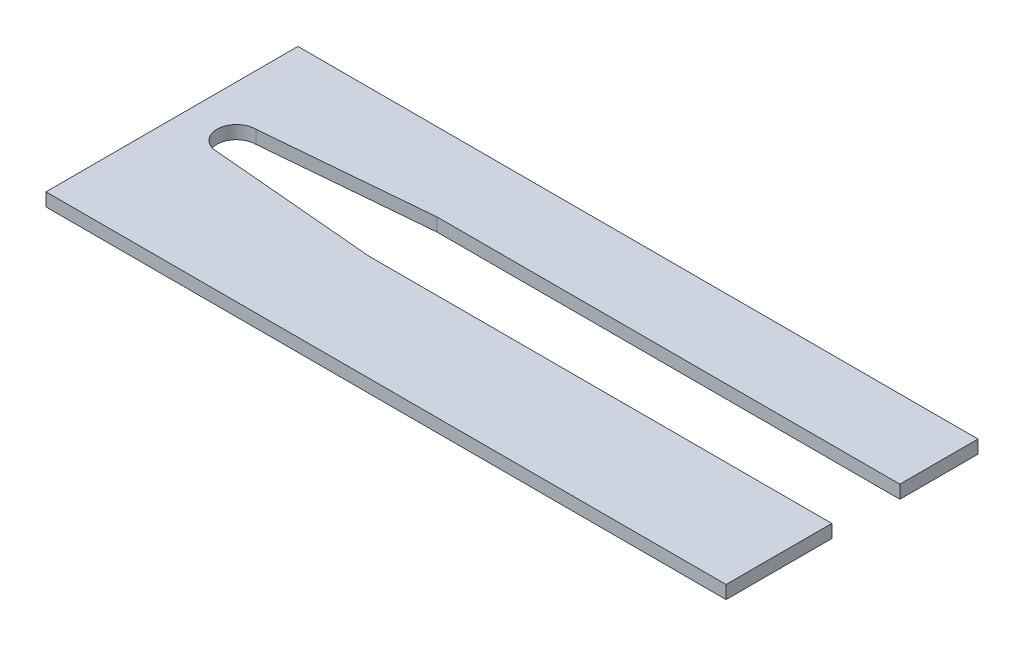
ISO-10303-21;
HEADER;
FILE_DESCRIPTION(('STEP AP214'),'2;1');
FILE_NAME('part.step','',(''),(''),'','','');
FILE_SCHEMA(('AUTOMOTIVE_DESIGN { 1 0 10303 214 1 1 1 1 }'));
ENDSEC;
DATA;
#1=APPLICATION_CONTEXT('core data for automotive mechanical design processes');
#2=APPLICATION_PROTOCOL_DEFINITION('international standard','automotive_design',2000,#1);
#3=PRODUCT_CONTEXT('',#1,'mechanical');
#4=PRODUCT('Part','Part','',(#3));
#5=PRODUCT_RELATED_PRODUCT_CATEGORY('part','',(#4));
#6=PRODUCT_DEFINITION_FORMATION('','',#4);
#7=PRODUCT_DEFINITION_CONTEXT('part definition',#1,'design');
#8=PRODUCT_DEFINITION('design','',#6,#7);
#9=PRODUCT_DEFINITION_SHAPE('','',#8);
#10=(LENGTH_UNIT() NAMED_UNIT(*) SI_UNIT(.MILLI.,.METRE.));
#11=(NAMED_UNIT(*) PLANE_ANGLE_UNIT() SI_UNIT($,.RADIAN.));
#12=(NAMED_UNIT(*) SI_UNIT($,.STERADIAN.) SOLID_ANGLE_UNIT());
#13=UNCERTAINTY_MEASURE_WITH_UNIT(LENGTH_MEASURE(1.E-05),#10,'distance_accuracy_value','');
#14=(GEOMETRIC_REPRESENTATION_CONTEXT(3) GLOBAL_UNCERTAINTY_ASSIGNED_CONTEXT((#13)) GLOBAL_UNIT_ASSIGNED_CONTEXT((#10,
#11,#12)) REPRESENTATION_CONTEXT('',''));
#15=CARTESIAN_POINT('',(0.,0.,0.));
#16=DIRECTION('',(0.,0.,1.));
#17=DIRECTION('',(1.,0.,0.));
#18=AXIS2_PLACEMENT_3D('',#15,#16,#17);
#19=CARTESIAN_POINT('',(37.3213193843782,0.675,-84.2902702317512));
#20=DIRECTION('',(-1.,0.,0.));
#21=DIRECTION('',(0.,0.,1.));
#22=AXIS2_PLACEMENT_3D('',#19,#20,#21);
#23=PLANE('',#22);
#24=DIRECTION('',(0.,0.,-1.));
#25=VECTOR('',#24,1.);
#26=CARTESIAN_POINT('',(37.3213193843782,0.,-84.2902702317512));
#27=LINE('',#26,#25);
#28=CARTESIAN_POINT('',(37.3213193843782,0.,-71.325962406726));
#29=VERTEX_POINT('',#28);
#30=CARTESIAN_POINT('',(37.3213193843782,0.,-76.7680112084191));
#31=VERTEX_POINT('',#30);
#32=EDGE_CURVE('E163',#29,#31,#27,.T.);
#33=ORIENTED_EDGE('',*,*,#32,.T.);
#34=DIRECTION('',(0.,1.,0.));
#35=VECTOR('',#34,1.);
#36=CARTESIAN_POINT('',(37.3213193843782,-0.00500000000000001,-76.7680112084191));
#37=LINE('',#36,#35);
#38=CARTESIAN_POINT('',(37.3213193843782,0.675,-76.7680112084191));
#39=VERTEX_POINT('',#38);
#40=EDGE_CURVE('E160',#31,#39,#37,.T.);
#41=ORIENTED_EDGE('',*,*,#40,.T.);
#42=DIRECTION('',(0.,0.,-1.));
#43=VECTOR('',#42,1.);
#44=CARTESIAN_POINT('',(37.3213193843782,0.675,-84.2902702317512));
#45=LINE('',#44,#43);
#46=CARTESIAN_POINT('',(37.3213193843782,0.675,-71.325962406726));
#47=VERTEX_POINT('',#46);
#48=EDGE_CURVE('E147',#47,#39,#45,.T.);
#49=ORIENTED_EDGE('',*,*,#48,.F.);
#50=DIRECTION('',(0.,-1.,0.));
#51=VECTOR('',#50,1.);
#52=CARTESIAN_POINT('',(37.3213193843782,0.675,-71.325962406726));
#53=LINE('',#52,#51);
#54=EDGE_CURVE('E169',#47,#29,#53,.T.);
#55=ORIENTED_EDGE('',*,*,#54,.T.);
#56=EDGE_LOOP('',(#33,#41,#49,#55));
#57=FACE_BOUND('',#56,.T.);
#58=ADVANCED_FACE('F40',(#57),#23,.F.);
#59=CARTESIAN_POINT('',(2.3213193843782,0.675,-84.2902702317512));
#60=DIRECTION('',(1.,0.,0.));
#61=DIRECTION('',(0.,0.,-1.));
#62=AXIS2_PLACEMENT_3D('',#59,#60,#61);
#63=PLANE('',#62);
#64=DIRECTION('',(0.,0.,1.));
#65=VECTOR('',#64,1.);
#66=CARTESIAN_POINT('',(2.3213193843782,0.,-84.2902702317512));
#67=LINE('',#66,#65);
#68=CARTESIAN_POINT('',(2.3213193843782,0.,-84.2902702317512));
#69=VERTEX_POINT('',#68);
#70=CARTESIAN_POINT('',(2.3213193843782,0.,-71.325962406726));
#71=VERTEX_POINT('',#70);
#72=EDGE_CURVE('E156',#69,#71,#67,.T.);
#73=ORIENTED_EDGE('',*,*,#72,.T.);
#74=DIRECTION('',(0.,-1.,0.));
#75=VECTOR('',#74,1.);
#76=CARTESIAN_POINT('',(2.3213193843782,0.675,-71.325962406726));
#77=LINE('',#76,#75);
#78=CARTESIAN_POINT('',(2.3213193843782,0.675,-71.325962406726));
#79=VERTEX_POINT('',#78);
#80=EDGE_CURVE('E172',#79,#71,#77,.T.);
#81=ORIENTED_EDGE('',*,*,#80,.F.);
#82=DIRECTION('',(0.,0.,1.));
#83=VECTOR('',#82,1.);
#84=CARTESIAN_POINT('',(2.3213193843782,0.675,-84.2902702317512));
#85=LINE('',#84,#83);
#86=CARTESIAN_POINT('',(2.3213193843782,0.675,-84.2902702317512));
#87=VERTEX_POINT('',#86);
#88=EDGE_CURVE('E150',#87,#79,#85,.T.);
#89=ORIENTED_EDGE('',*,*,#88,.F.);
#90=DIRECTION('',(0.,-1.,0.));
#91=VECTOR('',#90,1.);
#92=CARTESIAN_POINT('',(2.3213193843782,0.675,-84.2902702317512));
#93=LINE('',#92,#91);
#94=EDGE_CURVE('E155',#87,#69,#93,.T.);
#95=ORIENTED_EDGE('',*,*,#94,.T.);
#96=EDGE_LOOP('',(#73,#81,#89,#95));
#97=FACE_BOUND('',#96,.T.);
#98=ADVANCED_FACE('F42',(#97),#63,.F.);
#99=CARTESIAN_POINT('',(2.3213193843782,0.675,-71.325962406726));
#100=DIRECTION('',(0.,0.,-1.));
#101=DIRECTION('',(-1.,0.,0.));
#102=AXIS2_PLACEMENT_3D('',#99,#100,#101);
#103=PLANE('',#102);
#104=DIRECTION('',(1.,0.,0.));
#105=VECTOR('',#104,1.);
#106=CARTESIAN_POINT('',(2.3213193843782,0.,-71.325962406726));
#107=LINE('',#106,#105);
#108=EDGE_CURVE('E159',#71,#29,#107,.T.);
#109=ORIENTED_EDGE('',*,*,#108,.T.);
#110=ORIENTED_EDGE('',*,*,#54,.F.);
#111=DIRECTION('',(1.,0.,0.));
#112=VECTOR('',#111,1.);
#113=CARTESIAN_POINT('',(2.3213193843782,0.675,-71.325962406726));
#114=LINE('',#113,#112);
#115=EDGE_CURVE('E93',#79,#47,#114,.T.);
#116=ORIENTED_EDGE('',*,*,#115,.F.);
#117=ORIENTED_EDGE('',*,*,#80,.T.);
#118=EDGE_LOOP('',(#109,#110,#116,#117));
#119=FACE_BOUND('',#118,.T.);
#120=ADVANCED_FACE('F207',(#119),#103,.F.);
#121=CARTESIAN_POINT('',(37.3213193843782,0.675,-80.2680112084191));
#122=VERTEX_POINT('',#121);
#123=CARTESIAN_POINT('',(37.3213193843782,0.675,-84.2902702317512));
#124=VERTEX_POINT('',#123);
#125=EDGE_CURVE('E139',#122,#124,#45,.T.);
#126=ORIENTED_EDGE('',*,*,#125,.F.);
#127=DIRECTION('',(0.,1.,0.));
#128=VECTOR('',#127,1.);
#129=CARTESIAN_POINT('',(37.3213193843782,-0.00500000000000001,-80.2680112084191));
#130=LINE('',#129,#128);
#131=CARTESIAN_POINT('',(37.3213193843782,0.,-80.2680112084191));
#132=VERTEX_POINT('',#131);
#133=EDGE_CURVE('E125',#132,#122,#130,.T.);
#134=ORIENTED_EDGE('',*,*,#133,.F.);
#135=CARTESIAN_POINT('',(37.3213193843782,0.,-84.2902702317512));
#136=VERTEX_POINT('',#135);
#137=EDGE_CURVE('E162',#132,#136,#27,.T.);
#138=ORIENTED_EDGE('',*,*,#137,.T.);
#139=DIRECTION('',(0.,-1.,0.));
#140=VECTOR('',#139,1.);
#141=CARTESIAN_POINT('',(37.3213193843782,0.675,-84.2902702317512));
#142=LINE('',#141,#140);
#143=EDGE_CURVE('E146',#124,#136,#142,.T.);
#144=ORIENTED_EDGE('',*,*,#143,.F.);
#145=EDGE_LOOP('',(#126,#134,#138,#144));
#146=FACE_BOUND('',#145,.T.);
#147=ADVANCED_FACE('F145',(#146),#23,.F.);
#148=CARTESIAN_POINT('',(2.3213193843782,0.675,-84.2902702317512));
#149=DIRECTION('',(0.,0.,1.));
#150=DIRECTION('',(1.,0.,0.));
#151=AXIS2_PLACEMENT_3D('',#148,#149,#150);
#152=PLANE('',#151);
#153=DIRECTION('',(-1.,0.,0.));
#154=VECTOR('',#153,1.);
#155=CARTESIAN_POINT('',(2.3213193843782,0.,-84.2902702317512));
#156=LINE('',#155,#154);
#157=EDGE_CURVE('E85',#136,#69,#156,.T.);
#158=ORIENTED_EDGE('',*,*,#157,.T.);
#159=ORIENTED_EDGE('',*,*,#94,.F.);
#160=DIRECTION('',(-1.,0.,0.));
#161=VECTOR('',#160,1.);
#162=CARTESIAN_POINT('',(2.3213193843782,0.675,-84.2902702317512));
#163=LINE('',#162,#161);
#164=EDGE_CURVE('E64',#124,#87,#163,.T.);
#165=ORIENTED_EDGE('',*,*,#164,.F.);
#166=ORIENTED_EDGE('',*,*,#143,.T.);
#167=EDGE_LOOP('',(#158,#159,#165,#166));
#168=FACE_BOUND('',#167,.T.);
#169=ADVANCED_FACE('F219',(#168),#152,.F.);
#170=CARTESIAN_POINT('',(0.,0.675,0.));
#171=DIRECTION('',(0.,1.,0.));
#172=DIRECTION('',(0.,0.,1.));
#173=AXIS2_PLACEMENT_3D('',#170,#171,#172);
#174=PLANE('',#173);
#175=DIRECTION('',(1.,0.,0.));
#176=VECTOR('',#175,1.);
#177=CARTESIAN_POINT('',(13.5024541233021,0.675,-76.7680112084191));
#178=LINE('',#177,#176);
#179=CARTESIAN_POINT('',(13.5024541233021,0.675,-76.7680112084191));
#180=VERTEX_POINT('',#179);
#181=EDGE_CURVE('E135',#180,#39,#178,.T.);
#182=ORIENTED_EDGE('',*,*,#181,.F.);
#183=DIRECTION('',(0.996194698091746,0.,0.0871557427476585));
#184=VECTOR('',#183,1.);
#185=CARTESIAN_POINT('',(4.92991489623109,0.675,-77.5180112084191));
#186=LINE('',#185,#184);
#187=CARTESIAN_POINT('',(4.92991489623109,0.675,-77.5180112084191));
#188=VERTEX_POINT('',#187);
#189=EDGE_CURVE('E211',#188,#180,#186,.T.);
#190=ORIENTED_EDGE('',*,*,#189,.F.);
#191=CARTESIAN_POINT('',(4.92991489623109,0.675,-78.5180112084192));
#192=DIRECTION('',(0.,1.,0.));
#193=DIRECTION('',(0.,0.,1.));
#194=AXIS2_PLACEMENT_3D('',#191,#192,#193);
#195=CIRCLE('',#194,1.);
#196=CARTESIAN_POINT('',(4.92991489623109,0.675,-79.5180112084192));
#197=VERTEX_POINT('',#196);
#198=EDGE_CURVE('E195',#197,#188,#195,.T.);
#199=ORIENTED_EDGE('',*,*,#198,.F.);
#200=DIRECTION('',(-0.996194698091746,0.,0.0871557427476585));
#201=VECTOR('',#200,1.);
#202=CARTESIAN_POINT('',(4.92991489623109,0.675,-79.5180112084191));
#203=LINE('',#202,#201);
#204=CARTESIAN_POINT('',(13.5024541233021,0.675,-80.2680112084191));
#205=VERTEX_POINT('',#204);
#206=EDGE_CURVE('E143',#205,#197,#203,.T.);
#207=ORIENTED_EDGE('',*,*,#206,.F.);
#208=DIRECTION('',(-1.,0.,0.));
#209=VECTOR('',#208,1.);
#210=CARTESIAN_POINT('',(13.5024541233021,0.675,-80.2680112084191));
#211=LINE('',#210,#209);
#212=EDGE_CURVE('E128',#122,#205,#211,.T.);
#213=ORIENTED_EDGE('',*,*,#212,.F.);
#214=ORIENTED_EDGE('',*,*,#125,.T.);
#215=ORIENTED_EDGE('',*,*,#164,.T.);
#216=ORIENTED_EDGE('',*,*,#88,.T.);
#217=ORIENTED_EDGE('',*,*,#115,.T.);
#218=ORIENTED_EDGE('',*,*,#48,.T.);
#219=EDGE_LOOP('',(#182,#190,#199,#207,#213,#214,#215,#216,#217,#218));
#220=FACE_BOUND('',#219,.T.);
#221=ADVANCED_FACE('F138',(#220),#174,.T.);
#222=CARTESIAN_POINT('',(0.,0.,0.));
#223=DIRECTION('',(0.,1.,0.));
#224=DIRECTION('',(0.,0.,1.));
#225=AXIS2_PLACEMENT_3D('',#222,#223,#224);
#226=PLANE('',#225);
#227=DIRECTION('',(0.996194698091746,0.,0.0871557427476585));
#228=VECTOR('',#227,1.);
#229=CARTESIAN_POINT('',(6.76787893371952,0.,-77.3572101911705));
#230=LINE('',#229,#228);
#231=CARTESIAN_POINT('',(4.92991489623109,0.,-77.5180112084191));
#232=VERTEX_POINT('',#231);
#233=CARTESIAN_POINT('',(13.5024541233021,0.,-76.7680112084191));
#234=VERTEX_POINT('',#233);
#235=EDGE_CURVE('E48',#232,#234,#230,.T.);
#236=ORIENTED_EDGE('',*,*,#235,.T.);
#237=DIRECTION('',(1.,0.,0.));
#238=VECTOR('',#237,1.);
#239=CARTESIAN_POINT('',(0.,0.,-76.7680112084191));
#240=LINE('',#239,#238);
#241=EDGE_CURVE('E11',#234,#31,#240,.T.);
#242=ORIENTED_EDGE('',*,*,#241,.T.);
#243=ORIENTED_EDGE('',*,*,#32,.F.);
#244=ORIENTED_EDGE('',*,*,#108,.F.);
#245=ORIENTED_EDGE('',*,*,#72,.F.);
#246=ORIENTED_EDGE('',*,*,#157,.F.);
#247=ORIENTED_EDGE('',*,*,#137,.F.);
#248=DIRECTION('',(-1.,0.,0.));
#249=VECTOR('',#248,1.);
#250=CARTESIAN_POINT('',(0.,0.,-80.2680112084191));
#251=LINE('',#250,#249);
#252=CARTESIAN_POINT('',(13.5024541233021,0.,-80.2680112084191));
#253=VERTEX_POINT('',#252);
#254=EDGE_CURVE('E131',#132,#253,#251,.T.);
#255=ORIENTED_EDGE('',*,*,#254,.T.);
#256=DIRECTION('',(-0.996194698091746,0.,0.0871557427476585));
#257=VECTOR('',#256,1.);
#258=CARTESIAN_POINT('',(-6.86663062665411,0.,-78.4859472063991));
#259=LINE('',#258,#257);
#260=CARTESIAN_POINT('',(4.92991489623109,0.,-79.5180112084192));
#261=VERTEX_POINT('',#260);
#262=EDGE_CURVE('E175',#253,#261,#259,.T.);
#263=ORIENTED_EDGE('',*,*,#262,.T.);
#264=CARTESIAN_POINT('',(4.92991489623109,0.,-78.5180112084192));
#265=DIRECTION('',(0.,1.,0.));
#266=DIRECTION('',(0.,0.,1.));
#267=AXIS2_PLACEMENT_3D('',#264,#265,#266);
#268=CIRCLE('',#267,1.);
#269=EDGE_CURVE('E178',#261,#232,#268,.T.);
#270=ORIENTED_EDGE('',*,*,#269,.T.);
#271=EDGE_LOOP('',(#236,#242,#243,#244,#245,#246,#247,#255,#263,#270));
#272=FACE_BOUND('',#271,.T.);
#273=ADVANCED_FACE('F182',(#272),#226,.F.);
#274=CARTESIAN_POINT('',(13.5024541233021,-0.00500000000000001,-76.7680112084191));
#275=DIRECTION('',(0.,0.,1.));
#276=DIRECTION('',(1.,0.,0.));
#277=AXIS2_PLACEMENT_3D('',#274,#275,#276);
#278=PLANE('',#277);
#279=DIRECTION('',(0.,1.,0.));
#280=VECTOR('',#279,1.);
#281=CARTESIAN_POINT('',(13.5024541233021,-0.00500000000000001,-76.7680112084191));
#282=LINE('',#281,#280);
#283=EDGE_CURVE('E191',#234,#180,#282,.T.);
#284=ORIENTED_EDGE('',*,*,#283,.T.);
#285=ORIENTED_EDGE('',*,*,#181,.T.);
#286=ORIENTED_EDGE('',*,*,#40,.F.);
#287=ORIENTED_EDGE('',*,*,#241,.F.);
#288=EDGE_LOOP('',(#284,#285,#286,#287));
#289=FACE_BOUND('',#288,.T.);
#290=ADVANCED_FACE('F262',(#289),#278,.F.);
#291=CARTESIAN_POINT('',(4.92991489623109,-0.00500000000000001,-77.5180112084191));
#292=DIRECTION('',(-0.0871557427476585,0.,0.996194698091745));
#293=DIRECTION('',(0.996194698091746,0.,0.0871557427476585));
#294=AXIS2_PLACEMENT_3D('',#291,#292,#293);
#295=PLANE('',#294);
#296=DIRECTION('',(0.,1.,0.));
#297=VECTOR('',#296,1.);
#298=CARTESIAN_POINT('',(4.92991489623109,-0.00500000000000001,-77.5180112084191));
#299=LINE('',#298,#297);
#300=EDGE_CURVE('E189',#232,#188,#299,.T.);
#301=ORIENTED_EDGE('',*,*,#300,.T.);
#302=ORIENTED_EDGE('',*,*,#189,.T.);
#303=ORIENTED_EDGE('',*,*,#283,.F.);
#304=ORIENTED_EDGE('',*,*,#235,.F.);
#305=EDGE_LOOP('',(#301,#302,#303,#304));
#306=FACE_BOUND('',#305,.T.);
#307=ADVANCED_FACE('F187',(#306),#295,.F.);
#308=CARTESIAN_POINT('',(4.92991489623109,-0.00500000000000001,-78.5180112084192));
#309=DIRECTION('',(0.,1.,0.));
#310=DIRECTION('',(0.,0.,1.));
#311=AXIS2_PLACEMENT_3D('',#308,#309,#310);
#312=CYLINDRICAL_SURFACE('',#311,1.);
#313=DIRECTION('',(0.,1.,0.));
#314=VECTOR('',#313,1.);
#315=CARTESIAN_POINT('',(4.92991489623109,-0.00500000000000001,-79.5180112084192));
#316=LINE('',#315,#314);
#317=EDGE_CURVE('E197',#261,#197,#316,.T.);
#318=ORIENTED_EDGE('',*,*,#317,.T.);
#319=ORIENTED_EDGE('',*,*,#198,.T.);
#320=ORIENTED_EDGE('',*,*,#300,.F.);
#321=ORIENTED_EDGE('',*,*,#269,.F.);
#322=EDGE_LOOP('',(#318,#319,#320,#321));
#323=FACE_BOUND('',#322,.T.);
#324=ADVANCED_FACE('F193',(#323),#312,.F.);
#325=CARTESIAN_POINT('',(4.92991489623109,-0.00500000000000001,-79.5180112084191));
#326=DIRECTION('',(-0.0871557427476585,0.,-0.996194698091745));
#327=DIRECTION('',(-0.996194698091746,0.,0.0871557427476585));
#328=AXIS2_PLACEMENT_3D('',#325,#326,#327);
#329=PLANE('',#328);
#330=DIRECTION('',(0.,1.,0.));
#331=VECTOR('',#330,1.);
#332=CARTESIAN_POINT('',(13.5024541233021,-0.00500000000000001,-80.2680112084191));
#333=LINE('',#332,#331);
#334=EDGE_CURVE('E55',#253,#205,#333,.T.);
#335=ORIENTED_EDGE('',*,*,#334,.T.);
#336=ORIENTED_EDGE('',*,*,#206,.T.);
#337=ORIENTED_EDGE('',*,*,#317,.F.);
#338=ORIENTED_EDGE('',*,*,#262,.F.);
#339=EDGE_LOOP('',(#335,#336,#337,#338));
#340=FACE_BOUND('',#339,.T.);
#341=ADVANCED_FACE('F218',(#340),#329,.F.);
#342=CARTESIAN_POINT('',(13.5024541233021,-0.00500000000000001,-80.2680112084191));
#343=DIRECTION('',(0.,0.,-1.));
#344=DIRECTION('',(-1.,0.,0.));
#345=AXIS2_PLACEMENT_3D('',#342,#343,#344);
#346=PLANE('',#345);
#347=ORIENTED_EDGE('',*,*,#133,.T.);
#348=ORIENTED_EDGE('',*,*,#212,.T.);
#349=ORIENTED_EDGE('',*,*,#334,.F.);
#350=ORIENTED_EDGE('',*,*,#254,.F.);
#351=EDGE_LOOP('',(#347,#348,#349,#350));
#352=FACE_BOUND('',#351,.T.);
#353=ADVANCED_FACE('F127',(#352),#346,.F.);
#354=CLOSED_SHELL('',(#58,#98,#120,#147,#169,#221,#273,#290,#307,#324,#341,#353));
#355=MANIFOLD_SOLID_BREP('B2',#354);
#356=ADVANCED_BREP_SHAPE_REPRESENTATION('',(#18,#355),#14);
#357=SHAPE_DEFINITION_REPRESENTATION(#9,#356);
ENDSEC;
END-ISO-10303-21;
